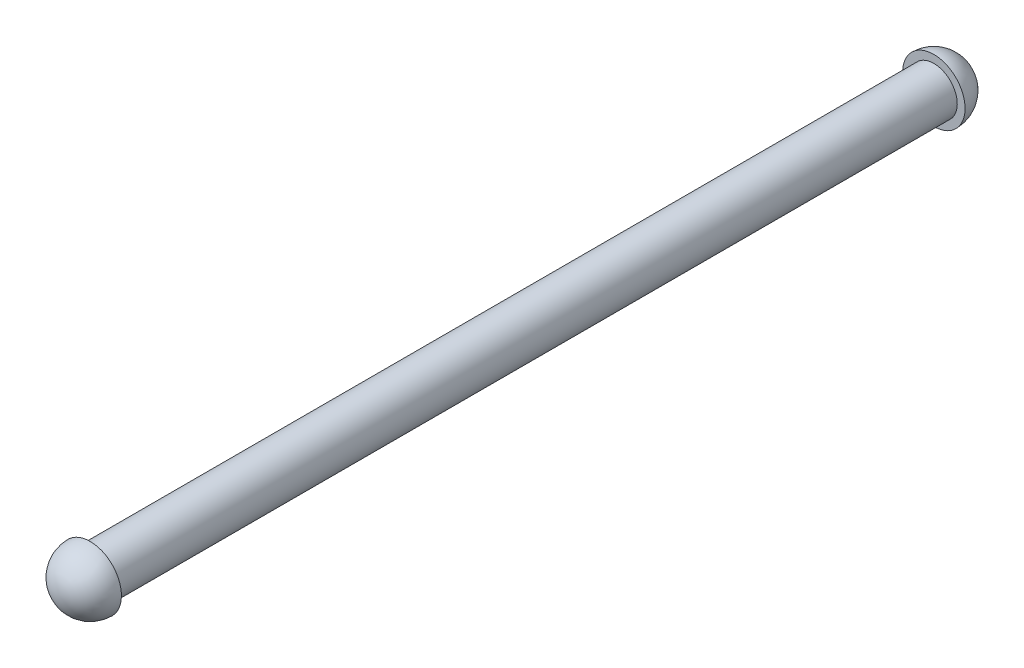
ISO-10303-21;
HEADER;
FILE_DESCRIPTION(('STEP AP214'),'2;1');
FILE_NAME('part.step','',(''),(''),'','','');
FILE_SCHEMA(('AUTOMOTIVE_DESIGN { 1 0 10303 214 1 1 1 1 }'));
ENDSEC;
DATA;
#1=APPLICATION_CONTEXT('core data for automotive mechanical design processes');
#2=APPLICATION_PROTOCOL_DEFINITION('international standard','automotive_design',2000,#1);
#3=PRODUCT_CONTEXT('',#1,'mechanical');
#4=PRODUCT('Part','Part','',(#3));
#5=PRODUCT_RELATED_PRODUCT_CATEGORY('part','',(#4));
#6=PRODUCT_DEFINITION_FORMATION('','',#4);
#7=PRODUCT_DEFINITION_CONTEXT('part definition',#1,'design');
#8=PRODUCT_DEFINITION('design','',#6,#7);
#9=PRODUCT_DEFINITION_SHAPE('','',#8);
#10=(LENGTH_UNIT() NAMED_UNIT(*) SI_UNIT(.MILLI.,.METRE.));
#11=(NAMED_UNIT(*) PLANE_ANGLE_UNIT() SI_UNIT($,.RADIAN.));
#12=(NAMED_UNIT(*) SI_UNIT($,.STERADIAN.) SOLID_ANGLE_UNIT());
#13=UNCERTAINTY_MEASURE_WITH_UNIT(LENGTH_MEASURE(1.E-05),#10,'distance_accuracy_value','');
#14=(GEOMETRIC_REPRESENTATION_CONTEXT(3) GLOBAL_UNCERTAINTY_ASSIGNED_CONTEXT((#13)) GLOBAL_UNIT_ASSIGNED_CONTEXT((#10,
#11,#12)) REPRESENTATION_CONTEXT('',''));
#15=CARTESIAN_POINT('',(0.,0.,0.));
#16=DIRECTION('',(0.,0.,1.));
#17=DIRECTION('',(1.,0.,0.));
#18=AXIS2_PLACEMENT_3D('',#15,#16,#17);
#19=CARTESIAN_POINT('',(0.,0.,0.));
#20=DIRECTION('',(-1.,0.,0.));
#21=DIRECTION('',(0.,-1.,0.));
#22=AXIS2_PLACEMENT_3D('',#19,#20,#21);
#23=SPHERICAL_SURFACE('',#22,0.5);
#24=CARTESIAN_POINT('',(0.,0.,0.));
#25=DIRECTION('',(0.,0.,-1.));
#26=DIRECTION('',(1.,0.,0.));
#27=AXIS2_PLACEMENT_3D('',#24,#25,#26);
#28=SPHERICAL_SURFACE('',#27,0.5);
#29=CARTESIAN_POINT('',(0.,0.,0.));
#30=DIRECTION('',(0.,0.,-1.));
#31=DIRECTION('',(1.,0.,0.));
#32=AXIS2_PLACEMENT_3D('',#29,#30,#31);
#33=CIRCLE('',#32,0.5);
#34=CARTESIAN_POINT('',(0.5,0.,0.));
#35=VERTEX_POINT('',#34);
#36=EDGE_CURVE('E39',#35,#35,#33,.T.);
#37=ORIENTED_EDGE('',*,*,#36,.T.);
#38=EDGE_LOOP('',(#37));
#39=FACE_BOUND('',#38,.T.);
#40=ADVANCED_FACE('F33',(#39),#28,.T.);
#41=CARTESIAN_POINT('',(0.,0.,0.));
#42=DIRECTION('',(0.,0.,-1.));
#43=DIRECTION('',(1.,0.,0.));
#44=AXIS2_PLACEMENT_3D('',#41,#42,#43);
#45=PLANE('',#44);
#46=CARTESIAN_POINT('',(0.,0.,0.));
#47=DIRECTION('',(0.,0.,-1.));
#48=DIRECTION('',(0.,1.,0.));
#49=AXIS2_PLACEMENT_3D('',#46,#47,#48);
#50=CIRCLE('',#49,0.375);
#51=CARTESIAN_POINT('',(0.,0.375,0.));
#52=VERTEX_POINT('',#51);
#53=EDGE_CURVE('E10',#52,#52,#50,.F.);
#54=ORIENTED_EDGE('',*,*,#53,.F.);
#55=EDGE_LOOP('',(#54));
#56=FACE_BOUND('',#55,.T.);
#57=ORIENTED_EDGE('',*,*,#36,.F.);
#58=EDGE_LOOP('',(#57));
#59=FACE_BOUND('',#58,.T.);
#60=ADVANCED_FACE('F65',(#56,#59),#45,.F.);
#61=CARTESIAN_POINT('',(0.,0.,13.5));
#62=DIRECTION('',(0.,0.,-1.));
#63=DIRECTION('',(-1.,0.,0.));
#64=AXIS2_PLACEMENT_3D('',#61,#62,#63);
#65=CYLINDRICAL_SURFACE('',#64,0.375);
#66=CARTESIAN_POINT('',(0.,0.,13.5));
#67=DIRECTION('',(0.,0.,1.));
#68=DIRECTION('',(1.,0.,0.));
#69=AXIS2_PLACEMENT_3D('',#66,#67,#68);
#70=CIRCLE('',#69,0.375);
#71=CARTESIAN_POINT('',(0.375,0.,13.5));
#72=VERTEX_POINT('',#71);
#73=EDGE_CURVE('E43',#72,#72,#70,.T.);
#74=ORIENTED_EDGE('',*,*,#73,.F.);
#75=EDGE_LOOP('',(#74));
#76=FACE_BOUND('',#75,.T.);
#77=ORIENTED_EDGE('',*,*,#53,.T.);
#78=EDGE_LOOP('',(#77));
#79=FACE_BOUND('',#78,.T.);
#80=ADVANCED_FACE('F57',(#76,#79),#65,.T.);
#81=CARTESIAN_POINT('',(0.,0.,13.5));
#82=DIRECTION('',(0.,-1.,0.));
#83=DIRECTION('',(1.,0.,0.));
#84=AXIS2_PLACEMENT_3D('',#81,#82,#83);
#85=SPHERICAL_SURFACE('',#84,0.5);
#86=CARTESIAN_POINT('',(0.,0.,13.5));
#87=DIRECTION('',(0.,0.,-1.));
#88=DIRECTION('',(-1.,0.,0.));
#89=AXIS2_PLACEMENT_3D('',#86,#87,#88);
#90=SPHERICAL_SURFACE('',#89,0.5);
#91=CARTESIAN_POINT('',(0.,0.,13.5));
#92=DIRECTION('',(0.,0.,-1.));
#93=DIRECTION('',(-1.,0.,0.));
#94=AXIS2_PLACEMENT_3D('',#91,#92,#93);
#95=CIRCLE('',#94,0.5);
#96=CARTESIAN_POINT('',(-0.5,0.,13.5));
#97=VERTEX_POINT('',#96);
#98=EDGE_CURVE('E47',#97,#97,#95,.T.);
#99=ORIENTED_EDGE('',*,*,#98,.F.);
#100=EDGE_LOOP('',(#99));
#101=FACE_BOUND('',#100,.T.);
#102=ADVANCED_FACE('F55',(#101),#90,.T.);
#103=CARTESIAN_POINT('',(0.,0.,13.5));
#104=DIRECTION('',(0.,0.,-1.));
#105=DIRECTION('',(-1.,0.,0.));
#106=AXIS2_PLACEMENT_3D('',#103,#104,#105);
#107=PLANE('',#106);
#108=ORIENTED_EDGE('',*,*,#73,.T.);
#109=EDGE_LOOP('',(#108));
#110=FACE_BOUND('',#109,.T.);
#111=ORIENTED_EDGE('',*,*,#98,.T.);
#112=EDGE_LOOP('',(#111));
#113=FACE_BOUND('',#112,.T.);
#114=ADVANCED_FACE('F53',(#110,#113),#107,.T.);
#115=CLOSED_SHELL('',(#40,#60,#80,#102,#114));
#116=MANIFOLD_SOLID_BREP('B2',#115);
#117=ADVANCED_BREP_SHAPE_REPRESENTATION('',(#18,#116),#14);
#118=SHAPE_DEFINITION_REPRESENTATION(#9,#117);
ENDSEC;
END-ISO-10303-21;
